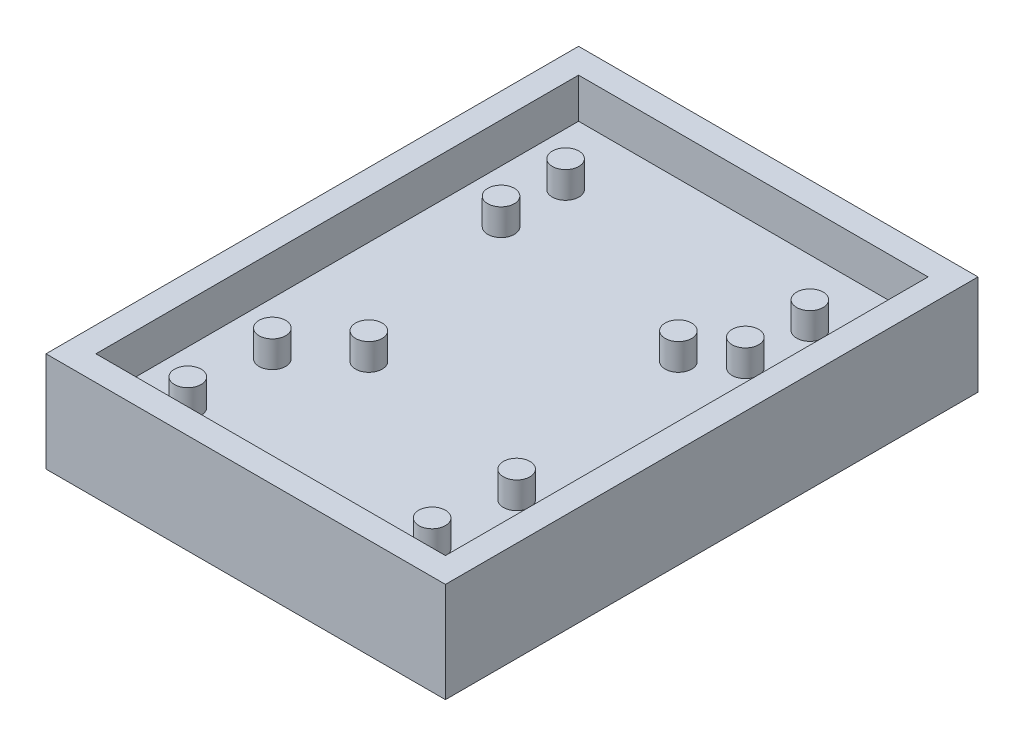
ISO-10303-21;
HEADER;
FILE_DESCRIPTION(('STEP AP214'),'2;1');
FILE_NAME('part.step','',(''),(''),'','','');
FILE_SCHEMA(('AUTOMOTIVE_DESIGN { 1 0 10303 214 1 1 1 1 }'));
ENDSEC;
DATA;
#1=APPLICATION_CONTEXT('core data for automotive mechanical design processes');
#2=APPLICATION_PROTOCOL_DEFINITION('international standard','automotive_design',2000,#1);
#3=PRODUCT_CONTEXT('',#1,'mechanical');
#4=PRODUCT('Part','Part','',(#3));
#5=PRODUCT_RELATED_PRODUCT_CATEGORY('part','',(#4));
#6=PRODUCT_DEFINITION_FORMATION('','',#4);
#7=PRODUCT_DEFINITION_CONTEXT('part definition',#1,'design');
#8=PRODUCT_DEFINITION('design','',#6,#7);
#9=PRODUCT_DEFINITION_SHAPE('','',#8);
#10=(LENGTH_UNIT() NAMED_UNIT(*) SI_UNIT(.MILLI.,.METRE.));
#11=(NAMED_UNIT(*) PLANE_ANGLE_UNIT() SI_UNIT($,.RADIAN.));
#12=(NAMED_UNIT(*) SI_UNIT($,.STERADIAN.) SOLID_ANGLE_UNIT());
#13=UNCERTAINTY_MEASURE_WITH_UNIT(LENGTH_MEASURE(1.E-05),#10,'distance_accuracy_value','');
#14=(GEOMETRIC_REPRESENTATION_CONTEXT(3) GLOBAL_UNCERTAINTY_ASSIGNED_CONTEXT((#13)) GLOBAL_UNIT_ASSIGNED_CONTEXT((#10,
#11,#12)) REPRESENTATION_CONTEXT('',''));
#15=CARTESIAN_POINT('',(0.,0.,0.));
#16=DIRECTION('',(0.,0.,1.));
#17=DIRECTION('',(1.,0.,0.));
#18=AXIS2_PLACEMENT_3D('',#15,#16,#17);
#19=CARTESIAN_POINT('',(60.,30.,80.));
#20=DIRECTION('',(0.,0.,1.));
#21=DIRECTION('',(1.,0.,0.));
#22=AXIS2_PLACEMENT_3D('',#19,#20,#21);
#23=PLANE('',#22);
#24=DIRECTION('',(-1.,0.,0.));
#25=VECTOR('',#24,1.);
#26=CARTESIAN_POINT('',(60.,0.,80.));
#27=LINE('',#26,#25);
#28=CARTESIAN_POINT('',(60.,0.,80.));
#29=VERTEX_POINT('',#28);
#30=CARTESIAN_POINT('',(-60.,0.,80.));
#31=VERTEX_POINT('',#30);
#32=EDGE_CURVE('E164',#29,#31,#27,.T.);
#33=ORIENTED_EDGE('',*,*,#32,.F.);
#34=DIRECTION('',(0.,-1.,0.));
#35=VECTOR('',#34,1.);
#36=CARTESIAN_POINT('',(60.,30.,80.));
#37=LINE('',#36,#35);
#38=CARTESIAN_POINT('',(60.,30.,80.));
#39=VERTEX_POINT('',#38);
#40=EDGE_CURVE('E67',#39,#29,#37,.T.);
#41=ORIENTED_EDGE('',*,*,#40,.F.);
#42=DIRECTION('',(-1.,0.,0.));
#43=VECTOR('',#42,1.);
#44=CARTESIAN_POINT('',(60.,30.,80.));
#45=LINE('',#44,#43);
#46=CARTESIAN_POINT('',(-60.,30.,80.));
#47=VERTEX_POINT('',#46);
#48=EDGE_CURVE('E170',#39,#47,#45,.T.);
#49=ORIENTED_EDGE('',*,*,#48,.T.);
#50=DIRECTION('',(0.,-1.,0.));
#51=VECTOR('',#50,1.);
#52=CARTESIAN_POINT('',(-60.,30.,80.));
#53=LINE('',#52,#51);
#54=EDGE_CURVE('E182',#47,#31,#53,.T.);
#55=ORIENTED_EDGE('',*,*,#54,.T.);
#56=EDGE_LOOP('',(#33,#41,#49,#55));
#57=FACE_BOUND('',#56,.T.);
#58=ADVANCED_FACE('F43',(#57),#23,.T.);
#59=CARTESIAN_POINT('',(60.,30.,-80.));
#60=DIRECTION('',(1.,0.,0.));
#61=DIRECTION('',(0.,0.,-1.));
#62=AXIS2_PLACEMENT_3D('',#59,#60,#61);
#63=PLANE('',#62);
#64=DIRECTION('',(0.,0.,1.));
#65=VECTOR('',#64,1.);
#66=CARTESIAN_POINT('',(60.,0.,-80.));
#67=LINE('',#66,#65);
#68=CARTESIAN_POINT('',(60.,0.,-80.));
#69=VERTEX_POINT('',#68);
#70=EDGE_CURVE('E173',#69,#29,#67,.T.);
#71=ORIENTED_EDGE('',*,*,#70,.F.);
#72=DIRECTION('',(0.,-1.,0.));
#73=VECTOR('',#72,1.);
#74=CARTESIAN_POINT('',(60.,30.,-80.));
#75=LINE('',#74,#73);
#76=CARTESIAN_POINT('',(60.,30.,-80.));
#77=VERTEX_POINT('',#76);
#78=EDGE_CURVE('E199',#77,#69,#75,.T.);
#79=ORIENTED_EDGE('',*,*,#78,.F.);
#80=DIRECTION('',(0.,0.,1.));
#81=VECTOR('',#80,1.);
#82=CARTESIAN_POINT('',(60.,30.,-80.));
#83=LINE('',#82,#81);
#84=EDGE_CURVE('E179',#77,#39,#83,.T.);
#85=ORIENTED_EDGE('',*,*,#84,.T.);
#86=ORIENTED_EDGE('',*,*,#40,.T.);
#87=EDGE_LOOP('',(#71,#79,#85,#86));
#88=FACE_BOUND('',#87,.T.);
#89=ADVANCED_FACE('F277',(#88),#63,.T.);
#90=CARTESIAN_POINT('',(60.,30.,-80.));
#91=DIRECTION('',(0.,0.,1.));
#92=DIRECTION('',(1.,0.,0.));
#93=AXIS2_PLACEMENT_3D('',#90,#91,#92);
#94=PLANE('',#93);
#95=DIRECTION('',(-1.,0.,0.));
#96=VECTOR('',#95,1.);
#97=CARTESIAN_POINT('',(60.,0.,-80.));
#98=LINE('',#97,#96);
#99=CARTESIAN_POINT('',(-60.,0.,-80.));
#100=VERTEX_POINT('',#99);
#101=EDGE_CURVE('E190',#69,#100,#98,.T.);
#102=ORIENTED_EDGE('',*,*,#101,.T.);
#103=DIRECTION('',(0.,-1.,0.));
#104=VECTOR('',#103,1.);
#105=CARTESIAN_POINT('',(-60.,30.,-80.));
#106=LINE('',#105,#104);
#107=CARTESIAN_POINT('',(-60.,30.,-80.));
#108=VERTEX_POINT('',#107);
#109=EDGE_CURVE('E202',#108,#100,#106,.T.);
#110=ORIENTED_EDGE('',*,*,#109,.F.);
#111=DIRECTION('',(-1.,0.,0.));
#112=VECTOR('',#111,1.);
#113=CARTESIAN_POINT('',(60.,30.,-80.));
#114=LINE('',#113,#112);
#115=EDGE_CURVE('E176',#77,#108,#114,.T.);
#116=ORIENTED_EDGE('',*,*,#115,.F.);
#117=ORIENTED_EDGE('',*,*,#78,.T.);
#118=EDGE_LOOP('',(#102,#110,#116,#117));
#119=FACE_BOUND('',#118,.T.);
#120=ADVANCED_FACE('F281',(#119),#94,.F.);
#121=CARTESIAN_POINT('',(-60.,30.,-80.));
#122=DIRECTION('',(1.,0.,0.));
#123=DIRECTION('',(0.,0.,-1.));
#124=AXIS2_PLACEMENT_3D('',#121,#122,#123);
#125=PLANE('',#124);
#126=DIRECTION('',(0.,0.,1.));
#127=VECTOR('',#126,1.);
#128=CARTESIAN_POINT('',(-60.,0.,-80.));
#129=LINE('',#128,#127);
#130=EDGE_CURVE('E186',#100,#31,#129,.T.);
#131=ORIENTED_EDGE('',*,*,#130,.T.);
#132=ORIENTED_EDGE('',*,*,#54,.F.);
#133=DIRECTION('',(0.,0.,1.));
#134=VECTOR('',#133,1.);
#135=CARTESIAN_POINT('',(-60.,30.,-80.));
#136=LINE('',#135,#134);
#137=EDGE_CURVE('E93',#108,#47,#136,.T.);
#138=ORIENTED_EDGE('',*,*,#137,.F.);
#139=ORIENTED_EDGE('',*,*,#109,.T.);
#140=EDGE_LOOP('',(#131,#132,#138,#139));
#141=FACE_BOUND('',#140,.T.);
#142=ADVANCED_FACE('F293',(#141),#125,.F.);
#143=CARTESIAN_POINT('',(0.,30.,0.));
#144=DIRECTION('',(0.,1.,0.));
#145=DIRECTION('',(0.,0.,1.));
#146=AXIS2_PLACEMENT_3D('',#143,#144,#145);
#147=PLANE('',#146);
#148=DIRECTION('',(1.,0.,0.));
#149=VECTOR('',#148,1.);
#150=CARTESIAN_POINT('',(-52.5,30.,72.5));
#151=LINE('',#150,#149);
#152=CARTESIAN_POINT('',(-52.5,30.,72.5));
#153=VERTEX_POINT('',#152);
#154=CARTESIAN_POINT('',(52.5,30.,72.5));
#155=VERTEX_POINT('',#154);
#156=EDGE_CURVE('E58',#153,#155,#151,.T.);
#157=ORIENTED_EDGE('',*,*,#156,.F.);
#158=DIRECTION('',(0.,0.,1.));
#159=VECTOR('',#158,1.);
#160=CARTESIAN_POINT('',(-52.5,30.,-72.5));
#161=LINE('',#160,#159);
#162=CARTESIAN_POINT('',(-52.5,30.,-72.5));
#163=VERTEX_POINT('',#162);
#164=EDGE_CURVE('E139',#163,#153,#161,.T.);
#165=ORIENTED_EDGE('',*,*,#164,.F.);
#166=DIRECTION('',(1.,0.,0.));
#167=VECTOR('',#166,1.);
#168=CARTESIAN_POINT('',(-52.5,30.,-72.5));
#169=LINE('',#168,#167);
#170=CARTESIAN_POINT('',(52.5,30.,-72.5));
#171=VERTEX_POINT('',#170);
#172=EDGE_CURVE('E143',#163,#171,#169,.T.);
#173=ORIENTED_EDGE('',*,*,#172,.T.);
#174=DIRECTION('',(0.,0.,1.));
#175=VECTOR('',#174,1.);
#176=CARTESIAN_POINT('',(52.5,30.,-72.5));
#177=LINE('',#176,#175);
#178=EDGE_CURVE('E155',#171,#155,#177,.T.);
#179=ORIENTED_EDGE('',*,*,#178,.T.);
#180=EDGE_LOOP('',(#157,#165,#173,#179));
#181=FACE_BOUND('',#180,.T.);
#182=ORIENTED_EDGE('',*,*,#48,.F.);
#183=ORIENTED_EDGE('',*,*,#84,.F.);
#184=ORIENTED_EDGE('',*,*,#115,.T.);
#185=ORIENTED_EDGE('',*,*,#137,.T.);
#186=EDGE_LOOP('',(#182,#183,#184,#185));
#187=FACE_BOUND('',#186,.T.);
#188=ADVANCED_FACE('F291',(#181,#187),#147,.T.);
#189=CARTESIAN_POINT('',(0.,0.,0.));
#190=DIRECTION('',(0.,1.,0.));
#191=DIRECTION('',(0.,0.,1.));
#192=AXIS2_PLACEMENT_3D('',#189,#190,#191);
#193=PLANE('',#192);
#194=ORIENTED_EDGE('',*,*,#32,.T.);
#195=ORIENTED_EDGE('',*,*,#130,.F.);
#196=ORIENTED_EDGE('',*,*,#101,.F.);
#197=ORIENTED_EDGE('',*,*,#70,.T.);
#198=EDGE_LOOP('',(#194,#195,#196,#197));
#199=FACE_BOUND('',#198,.T.);
#200=ADVANCED_FACE('F286',(#199),#193,.F.);
#201=CARTESIAN_POINT('',(-52.5,18.,72.5));
#202=DIRECTION('',(0.,0.,1.));
#203=DIRECTION('',(1.,0.,0.));
#204=AXIS2_PLACEMENT_3D('',#201,#202,#203);
#205=PLANE('',#204);
#206=ORIENTED_EDGE('',*,*,#156,.T.);
#207=DIRECTION('',(0.,1.,0.));
#208=VECTOR('',#207,1.);
#209=CARTESIAN_POINT('',(52.5,18.,72.5));
#210=LINE('',#209,#208);
#211=CARTESIAN_POINT('',(52.5,18.,72.5));
#212=VERTEX_POINT('',#211);
#213=EDGE_CURVE('E120',#212,#155,#210,.T.);
#214=ORIENTED_EDGE('',*,*,#213,.F.);
#215=DIRECTION('',(1.,0.,0.));
#216=VECTOR('',#215,1.);
#217=CARTESIAN_POINT('',(-52.5,18.,72.5));
#218=LINE('',#217,#216);
#219=CARTESIAN_POINT('',(-52.5,18.,72.5));
#220=VERTEX_POINT('',#219);
#221=EDGE_CURVE('E128',#220,#212,#218,.T.);
#222=ORIENTED_EDGE('',*,*,#221,.F.);
#223=DIRECTION('',(0.,1.,0.));
#224=VECTOR('',#223,1.);
#225=CARTESIAN_POINT('',(-52.5,18.,72.5));
#226=LINE('',#225,#224);
#227=EDGE_CURVE('E161',#220,#153,#226,.T.);
#228=ORIENTED_EDGE('',*,*,#227,.T.);
#229=EDGE_LOOP('',(#206,#214,#222,#228));
#230=FACE_BOUND('',#229,.T.);
#231=ADVANCED_FACE('F131',(#230),#205,.F.);
#232=CARTESIAN_POINT('',(-52.5,18.,-72.5));
#233=DIRECTION('',(-1.,0.,0.));
#234=DIRECTION('',(0.,0.,1.));
#235=AXIS2_PLACEMENT_3D('',#232,#233,#234);
#236=PLANE('',#235);
#237=ORIENTED_EDGE('',*,*,#164,.T.);
#238=ORIENTED_EDGE('',*,*,#227,.F.);
#239=DIRECTION('',(0.,0.,1.));
#240=VECTOR('',#239,1.);
#241=CARTESIAN_POINT('',(-52.5,18.,-72.5));
#242=LINE('',#241,#240);
#243=CARTESIAN_POINT('',(-52.5,18.,-72.5));
#244=VERTEX_POINT('',#243);
#245=EDGE_CURVE('E134',#244,#220,#242,.T.);
#246=ORIENTED_EDGE('',*,*,#245,.F.);
#247=DIRECTION('',(0.,1.,0.));
#248=VECTOR('',#247,1.);
#249=CARTESIAN_POINT('',(-52.5,18.,-72.5));
#250=LINE('',#249,#248);
#251=EDGE_CURVE('E165',#244,#163,#250,.T.);
#252=ORIENTED_EDGE('',*,*,#251,.T.);
#253=EDGE_LOOP('',(#237,#238,#246,#252));
#254=FACE_BOUND('',#253,.T.);
#255=ADVANCED_FACE('F336',(#254),#236,.F.);
#256=CARTESIAN_POINT('',(-52.5,18.,-72.5));
#257=DIRECTION('',(0.,0.,1.));
#258=DIRECTION('',(1.,0.,0.));
#259=AXIS2_PLACEMENT_3D('',#256,#257,#258);
#260=PLANE('',#259);
#261=ORIENTED_EDGE('',*,*,#172,.F.);
#262=ORIENTED_EDGE('',*,*,#251,.F.);
#263=DIRECTION('',(1.,0.,0.));
#264=VECTOR('',#263,1.);
#265=CARTESIAN_POINT('',(-52.5,18.,-72.5));
#266=LINE('',#265,#264);
#267=CARTESIAN_POINT('',(52.5,18.,-72.5));
#268=VERTEX_POINT('',#267);
#269=EDGE_CURVE('E127',#244,#268,#266,.T.);
#270=ORIENTED_EDGE('',*,*,#269,.T.);
#271=DIRECTION('',(0.,1.,0.));
#272=VECTOR('',#271,1.);
#273=CARTESIAN_POINT('',(52.5,18.,-72.5));
#274=LINE('',#273,#272);
#275=EDGE_CURVE('E122',#268,#171,#274,.T.);
#276=ORIENTED_EDGE('',*,*,#275,.T.);
#277=EDGE_LOOP('',(#261,#262,#270,#276));
#278=FACE_BOUND('',#277,.T.);
#279=ADVANCED_FACE('F345',(#278),#260,.T.);
#280=CARTESIAN_POINT('',(52.5,18.,-72.5));
#281=DIRECTION('',(-1.,0.,0.));
#282=DIRECTION('',(0.,0.,1.));
#283=AXIS2_PLACEMENT_3D('',#280,#281,#282);
#284=PLANE('',#283);
#285=ORIENTED_EDGE('',*,*,#178,.F.);
#286=ORIENTED_EDGE('',*,*,#275,.F.);
#287=DIRECTION('',(0.,0.,1.));
#288=VECTOR('',#287,1.);
#289=CARTESIAN_POINT('',(52.5,18.,-72.5));
#290=LINE('',#289,#288);
#291=EDGE_CURVE('E117',#268,#212,#290,.T.);
#292=ORIENTED_EDGE('',*,*,#291,.T.);
#293=ORIENTED_EDGE('',*,*,#213,.T.);
#294=EDGE_LOOP('',(#285,#286,#292,#293));
#295=FACE_BOUND('',#294,.T.);
#296=ADVANCED_FACE('F119',(#295),#284,.T.);
#297=CARTESIAN_POINT('',(0.,18.,0.));
#298=DIRECTION('',(0.,-1.,0.));
#299=DIRECTION('',(0.,0.,-1.));
#300=AXIS2_PLACEMENT_3D('',#297,#298,#299);
#301=PLANE('',#300);
#302=CARTESIAN_POINT('',(36.7,18.,-52.8096236155543));
#303=DIRECTION('',(0.,-1.,0.));
#304=DIRECTION('',(0.,0.,-1.));
#305=AXIS2_PLACEMENT_3D('',#302,#303,#304);
#306=CIRCLE('',#305,4.00000000000001);
#307=CARTESIAN_POINT('',(36.7,18.,-56.8096236155543));
#308=VERTEX_POINT('',#307);
#309=EDGE_CURVE('E11',#308,#308,#306,.F.);
#310=ORIENTED_EDGE('',*,*,#309,.F.);
#311=EDGE_LOOP('',(#310));
#312=FACE_BOUND('',#311,.T.);
#313=CARTESIAN_POINT('',(-36.7,18.,-52.8096236155543));
#314=DIRECTION('',(0.,-1.,0.));
#315=DIRECTION('',(0.,0.,-1.));
#316=AXIS2_PLACEMENT_3D('',#313,#314,#315);
#317=CIRCLE('',#316,4.00000000000001);
#318=CARTESIAN_POINT('',(-36.7,18.,-56.8096236155543));
#319=VERTEX_POINT('',#318);
#320=EDGE_CURVE('E51',#319,#319,#317,.F.);
#321=ORIENTED_EDGE('',*,*,#320,.F.);
#322=EDGE_LOOP('',(#321));
#323=FACE_BOUND('',#322,.T.);
#324=CARTESIAN_POINT('',(-36.7,18.,-33.4096236155543));
#325=DIRECTION('',(0.,-1.,0.));
#326=DIRECTION('',(0.,0.,-1.));
#327=AXIS2_PLACEMENT_3D('',#324,#325,#326);
#328=CIRCLE('',#327,4.00000000000001);
#329=CARTESIAN_POINT('',(-36.7,18.,-37.4096236155543));
#330=VERTEX_POINT('',#329);
#331=EDGE_CURVE('E235',#330,#330,#328,.F.);
#332=ORIENTED_EDGE('',*,*,#331,.F.);
#333=EDGE_LOOP('',(#332));
#334=FACE_BOUND('',#333,.T.);
#335=CARTESIAN_POINT('',(36.7,18.,-33.4096236155543));
#336=DIRECTION('',(0.,-1.,0.));
#337=DIRECTION('',(0.,0.,-1.));
#338=AXIS2_PLACEMENT_3D('',#335,#336,#337);
#339=CIRCLE('',#338,4.);
#340=CARTESIAN_POINT('',(36.7,18.,-37.4096236155543));
#341=VERTEX_POINT('',#340);
#342=EDGE_CURVE('E231',#341,#341,#339,.F.);
#343=ORIENTED_EDGE('',*,*,#342,.F.);
#344=EDGE_LOOP('',(#343));
#345=FACE_BOUND('',#344,.T.);
#346=CARTESIAN_POINT('',(-36.7,18.,60.7));
#347=DIRECTION('',(0.,-1.,0.));
#348=DIRECTION('',(0.,0.,-1.));
#349=AXIS2_PLACEMENT_3D('',#346,#347,#348);
#350=CIRCLE('',#349,4.);
#351=CARTESIAN_POINT('',(-36.7,18.,56.7));
#352=VERTEX_POINT('',#351);
#353=EDGE_CURVE('E227',#352,#352,#350,.F.);
#354=ORIENTED_EDGE('',*,*,#353,.F.);
#355=EDGE_LOOP('',(#354));
#356=FACE_BOUND('',#355,.T.);
#357=CARTESIAN_POINT('',(36.7,18.,60.7));
#358=DIRECTION('',(0.,-1.,0.));
#359=DIRECTION('',(0.,0.,-1.));
#360=AXIS2_PLACEMENT_3D('',#357,#358,#359);
#361=CIRCLE('',#360,4.00000000000001);
#362=CARTESIAN_POINT('',(36.7,18.,56.7));
#363=VERTEX_POINT('',#362);
#364=EDGE_CURVE('E223',#363,#363,#361,.F.);
#365=ORIENTED_EDGE('',*,*,#364,.F.);
#366=EDGE_LOOP('',(#365));
#367=FACE_BOUND('',#366,.T.);
#368=CARTESIAN_POINT('',(36.7,18.,35.3));
#369=DIRECTION('',(0.,-1.,0.));
#370=DIRECTION('',(0.,0.,-1.));
#371=AXIS2_PLACEMENT_3D('',#368,#369,#370);
#372=CIRCLE('',#371,4.00000000000001);
#373=CARTESIAN_POINT('',(36.7,18.,31.3));
#374=VERTEX_POINT('',#373);
#375=EDGE_CURVE('E219',#374,#374,#372,.F.);
#376=ORIENTED_EDGE('',*,*,#375,.F.);
#377=EDGE_LOOP('',(#376));
#378=FACE_BOUND('',#377,.T.);
#379=CARTESIAN_POINT('',(-36.7,18.,35.3));
#380=DIRECTION('',(0.,-1.,0.));
#381=DIRECTION('',(0.,0.,-1.));
#382=AXIS2_PLACEMENT_3D('',#379,#380,#381);
#383=CIRCLE('',#382,4.00000000000001);
#384=CARTESIAN_POINT('',(-36.7,18.,31.3));
#385=VERTEX_POINT('',#384);
#386=EDGE_CURVE('E215',#385,#385,#383,.F.);
#387=ORIENTED_EDGE('',*,*,#386,.F.);
#388=EDGE_LOOP('',(#387));
#389=FACE_BOUND('',#388,.T.);
#390=CARTESIAN_POINT('',(25.,18.,-25.));
#391=DIRECTION('',(0.,-1.,0.));
#392=DIRECTION('',(0.,0.,-1.));
#393=AXIS2_PLACEMENT_3D('',#390,#391,#392);
#394=CIRCLE('',#393,4.);
#395=CARTESIAN_POINT('',(25.,18.,-29.));
#396=VERTEX_POINT('',#395);
#397=EDGE_CURVE('E211',#396,#396,#394,.F.);
#398=ORIENTED_EDGE('',*,*,#397,.F.);
#399=EDGE_LOOP('',(#398));
#400=FACE_BOUND('',#399,.T.);
#401=CARTESIAN_POINT('',(-21.5,18.,21.5));
#402=DIRECTION('',(0.,-1.,0.));
#403=DIRECTION('',(0.,0.,-1.));
#404=AXIS2_PLACEMENT_3D('',#401,#402,#403);
#405=CIRCLE('',#404,4.);
#406=CARTESIAN_POINT('',(-21.5,18.,17.5));
#407=VERTEX_POINT('',#406);
#408=EDGE_CURVE('E198',#407,#407,#405,.F.);
#409=ORIENTED_EDGE('',*,*,#408,.F.);
#410=EDGE_LOOP('',(#409));
#411=FACE_BOUND('',#410,.T.);
#412=ORIENTED_EDGE('',*,*,#221,.T.);
#413=ORIENTED_EDGE('',*,*,#291,.F.);
#414=ORIENTED_EDGE('',*,*,#269,.F.);
#415=ORIENTED_EDGE('',*,*,#245,.T.);
#416=EDGE_LOOP('',(#412,#413,#414,#415));
#417=FACE_BOUND('',#416,.T.);
#418=ADVANCED_FACE('F136',(#312,#323,#334,#345,#356,#367,#378,#389,#400,#411,#417),#301,.F.);
#419=CARTESIAN_POINT('',(-21.5,26.,21.5));
#420=DIRECTION('',(0.,-1.,0.));
#421=DIRECTION('',(0.,0.,-1.));
#422=AXIS2_PLACEMENT_3D('',#419,#420,#421);
#423=CYLINDRICAL_SURFACE('',#422,4.);
#424=CARTESIAN_POINT('',(-21.5,26.,21.5));
#425=DIRECTION('',(0.,1.,0.));
#426=DIRECTION('',(0.,0.,1.));
#427=AXIS2_PLACEMENT_3D('',#424,#425,#426);
#428=CIRCLE('',#427,4.);
#429=CARTESIAN_POINT('',(-21.5,26.,25.5));
#430=VERTEX_POINT('',#429);
#431=EDGE_CURVE('E146',#430,#430,#428,.T.);
#432=ORIENTED_EDGE('',*,*,#431,.F.);
#433=EDGE_LOOP('',(#432));
#434=FACE_BOUND('',#433,.T.);
#435=ORIENTED_EDGE('',*,*,#408,.T.);
#436=EDGE_LOOP('',(#435));
#437=FACE_BOUND('',#436,.T.);
#438=ADVANCED_FACE('F246',(#434,#437),#423,.T.);
#439=CARTESIAN_POINT('',(-21.5,26.,21.5));
#440=DIRECTION('',(0.,1.,0.));
#441=DIRECTION('',(0.,0.,1.));
#442=AXIS2_PLACEMENT_3D('',#439,#440,#441);
#443=PLANE('',#442);
#444=ORIENTED_EDGE('',*,*,#431,.T.);
#445=EDGE_LOOP('',(#444));
#446=FACE_BOUND('',#445,.T.);
#447=ADVANCED_FACE('F266',(#446),#443,.T.);
#448=CARTESIAN_POINT('',(25.,26.,-25.));
#449=DIRECTION('',(0.,-1.,0.));
#450=DIRECTION('',(0.,0.,-1.));
#451=AXIS2_PLACEMENT_3D('',#448,#449,#450);
#452=CYLINDRICAL_SURFACE('',#451,4.);
#453=CARTESIAN_POINT('',(25.,26.,-25.));
#454=DIRECTION('',(0.,1.,0.));
#455=DIRECTION('',(0.,0.,1.));
#456=AXIS2_PLACEMENT_3D('',#453,#454,#455);
#457=CIRCLE('',#456,4.);
#458=CARTESIAN_POINT('',(25.,26.,-21.));
#459=VERTEX_POINT('',#458);
#460=EDGE_CURVE('E661',#459,#459,#457,.T.);
#461=ORIENTED_EDGE('',*,*,#460,.F.);
#462=EDGE_LOOP('',(#461));
#463=FACE_BOUND('',#462,.T.);
#464=ORIENTED_EDGE('',*,*,#397,.T.);
#465=EDGE_LOOP('',(#464));
#466=FACE_BOUND('',#465,.T.);
#467=ADVANCED_FACE('F272',(#463,#466),#452,.T.);
#468=CARTESIAN_POINT('',(25.,26.,-25.));
#469=DIRECTION('',(0.,1.,0.));
#470=DIRECTION('',(0.,0.,1.));
#471=AXIS2_PLACEMENT_3D('',#468,#469,#470);
#472=PLANE('',#471);
#473=ORIENTED_EDGE('',*,*,#460,.T.);
#474=EDGE_LOOP('',(#473));
#475=FACE_BOUND('',#474,.T.);
#476=ADVANCED_FACE('F393',(#475),#472,.T.);
#477=CARTESIAN_POINT('',(-36.7,26.,35.3));
#478=DIRECTION('',(0.,-1.,0.));
#479=DIRECTION('',(0.,0.,-1.));
#480=AXIS2_PLACEMENT_3D('',#477,#478,#479);
#481=CYLINDRICAL_SURFACE('',#480,4.00000000000001);
#482=CARTESIAN_POINT('',(-36.7,26.,35.3));
#483=DIRECTION('',(0.,1.,0.));
#484=DIRECTION('',(0.,0.,1.));
#485=AXIS2_PLACEMENT_3D('',#482,#483,#484);
#486=CIRCLE('',#485,4.00000000000001);
#487=CARTESIAN_POINT('',(-36.7,26.,39.3));
#488=VERTEX_POINT('',#487);
#489=EDGE_CURVE('E658',#488,#488,#486,.T.);
#490=ORIENTED_EDGE('',*,*,#489,.F.);
#491=EDGE_LOOP('',(#490));
#492=FACE_BOUND('',#491,.T.);
#493=ORIENTED_EDGE('',*,*,#386,.T.);
#494=EDGE_LOOP('',(#493));
#495=FACE_BOUND('',#494,.T.);
#496=ADVANCED_FACE('F404',(#492,#495),#481,.T.);
#497=CARTESIAN_POINT('',(-36.7,26.,35.3));
#498=DIRECTION('',(0.,1.,0.));
#499=DIRECTION('',(0.,0.,1.));
#500=AXIS2_PLACEMENT_3D('',#497,#498,#499);
#501=PLANE('',#500);
#502=ORIENTED_EDGE('',*,*,#489,.T.);
#503=EDGE_LOOP('',(#502));
#504=FACE_BOUND('',#503,.T.);
#505=ADVANCED_FACE('F415',(#504),#501,.T.);
#506=CARTESIAN_POINT('',(36.7,26.,35.3));
#507=DIRECTION('',(0.,-1.,0.));
#508=DIRECTION('',(0.,0.,-1.));
#509=AXIS2_PLACEMENT_3D('',#506,#507,#508);
#510=CYLINDRICAL_SURFACE('',#509,4.00000000000001);
#511=CARTESIAN_POINT('',(36.7,26.,35.3));
#512=DIRECTION('',(0.,1.,0.));
#513=DIRECTION('',(0.,0.,1.));
#514=AXIS2_PLACEMENT_3D('',#511,#512,#513);
#515=CIRCLE('',#514,4.00000000000001);
#516=CARTESIAN_POINT('',(36.7,26.,39.3));
#517=VERTEX_POINT('',#516);
#518=EDGE_CURVE('E654',#517,#517,#515,.T.);
#519=ORIENTED_EDGE('',*,*,#518,.F.);
#520=EDGE_LOOP('',(#519));
#521=FACE_BOUND('',#520,.T.);
#522=ORIENTED_EDGE('',*,*,#375,.T.);
#523=EDGE_LOOP('',(#522));
#524=FACE_BOUND('',#523,.T.);
#525=ADVANCED_FACE('F426',(#521,#524),#510,.T.);
#526=CARTESIAN_POINT('',(36.7,26.,35.3));
#527=DIRECTION('',(0.,1.,0.));
#528=DIRECTION('',(0.,0.,1.));
#529=AXIS2_PLACEMENT_3D('',#526,#527,#528);
#530=PLANE('',#529);
#531=ORIENTED_EDGE('',*,*,#518,.T.);
#532=EDGE_LOOP('',(#531));
#533=FACE_BOUND('',#532,.T.);
#534=ADVANCED_FACE('F437',(#533),#530,.T.);
#535=CARTESIAN_POINT('',(36.7,26.,60.7));
#536=DIRECTION('',(0.,-1.,0.));
#537=DIRECTION('',(0.,0.,-1.));
#538=AXIS2_PLACEMENT_3D('',#535,#536,#537);
#539=CYLINDRICAL_SURFACE('',#538,4.00000000000001);
#540=CARTESIAN_POINT('',(36.7,26.,60.7));
#541=DIRECTION('',(0.,1.,0.));
#542=DIRECTION('',(0.,0.,1.));
#543=AXIS2_PLACEMENT_3D('',#540,#541,#542);
#544=CIRCLE('',#543,4.00000000000001);
#545=CARTESIAN_POINT('',(36.7,26.,64.7));
#546=VERTEX_POINT('',#545);
#547=EDGE_CURVE('E650',#546,#546,#544,.T.);
#548=ORIENTED_EDGE('',*,*,#547,.F.);
#549=EDGE_LOOP('',(#548));
#550=FACE_BOUND('',#549,.T.);
#551=ORIENTED_EDGE('',*,*,#364,.T.);
#552=EDGE_LOOP('',(#551));
#553=FACE_BOUND('',#552,.T.);
#554=ADVANCED_FACE('F448',(#550,#553),#539,.T.);
#555=CARTESIAN_POINT('',(36.7,26.,60.7));
#556=DIRECTION('',(0.,1.,0.));
#557=DIRECTION('',(0.,0.,1.));
#558=AXIS2_PLACEMENT_3D('',#555,#556,#557);
#559=PLANE('',#558);
#560=ORIENTED_EDGE('',*,*,#547,.T.);
#561=EDGE_LOOP('',(#560));
#562=FACE_BOUND('',#561,.T.);
#563=ADVANCED_FACE('F459',(#562),#559,.T.);
#564=CARTESIAN_POINT('',(-36.7,26.,60.7));
#565=DIRECTION('',(0.,-1.,0.));
#566=DIRECTION('',(0.,0.,-1.));
#567=AXIS2_PLACEMENT_3D('',#564,#565,#566);
#568=CYLINDRICAL_SURFACE('',#567,4.);
#569=CARTESIAN_POINT('',(-36.7,26.,60.7));
#570=DIRECTION('',(0.,1.,0.));
#571=DIRECTION('',(0.,0.,1.));
#572=AXIS2_PLACEMENT_3D('',#569,#570,#571);
#573=CIRCLE('',#572,4.);
#574=CARTESIAN_POINT('',(-36.7,26.,64.7));
#575=VERTEX_POINT('',#574);
#576=EDGE_CURVE('E646',#575,#575,#573,.T.);
#577=ORIENTED_EDGE('',*,*,#576,.F.);
#578=EDGE_LOOP('',(#577));
#579=FACE_BOUND('',#578,.T.);
#580=ORIENTED_EDGE('',*,*,#353,.T.);
#581=EDGE_LOOP('',(#580));
#582=FACE_BOUND('',#581,.T.);
#583=ADVANCED_FACE('F470',(#579,#582),#568,.T.);
#584=CARTESIAN_POINT('',(-36.7,26.,60.7));
#585=DIRECTION('',(0.,1.,0.));
#586=DIRECTION('',(0.,0.,1.));
#587=AXIS2_PLACEMENT_3D('',#584,#585,#586);
#588=PLANE('',#587);
#589=ORIENTED_EDGE('',*,*,#576,.T.);
#590=EDGE_LOOP('',(#589));
#591=FACE_BOUND('',#590,.T.);
#592=ADVANCED_FACE('F481',(#591),#588,.T.);
#593=CARTESIAN_POINT('',(36.7,26.,-33.4096236155543));
#594=DIRECTION('',(0.,-1.,0.));
#595=DIRECTION('',(0.,0.,-1.));
#596=AXIS2_PLACEMENT_3D('',#593,#594,#595);
#597=CYLINDRICAL_SURFACE('',#596,4.);
#598=CARTESIAN_POINT('',(36.7,26.,-33.4096236155543));
#599=DIRECTION('',(0.,1.,0.));
#600=DIRECTION('',(0.,0.,1.));
#601=AXIS2_PLACEMENT_3D('',#598,#599,#600);
#602=CIRCLE('',#601,4.);
#603=CARTESIAN_POINT('',(36.7,26.,-29.4096236155543));
#604=VERTEX_POINT('',#603);
#605=EDGE_CURVE('E642',#604,#604,#602,.T.);
#606=ORIENTED_EDGE('',*,*,#605,.F.);
#607=EDGE_LOOP('',(#606));
#608=FACE_BOUND('',#607,.T.);
#609=ORIENTED_EDGE('',*,*,#342,.T.);
#610=EDGE_LOOP('',(#609));
#611=FACE_BOUND('',#610,.T.);
#612=ADVANCED_FACE('F492',(#608,#611),#597,.T.);
#613=CARTESIAN_POINT('',(36.7,26.,-33.4096236155543));
#614=DIRECTION('',(0.,1.,0.));
#615=DIRECTION('',(0.,0.,1.));
#616=AXIS2_PLACEMENT_3D('',#613,#614,#615);
#617=PLANE('',#616);
#618=ORIENTED_EDGE('',*,*,#605,.T.);
#619=EDGE_LOOP('',(#618));
#620=FACE_BOUND('',#619,.T.);
#621=ADVANCED_FACE('F503',(#620),#617,.T.);
#622=CARTESIAN_POINT('',(-36.7,26.,-33.4096236155543));
#623=DIRECTION('',(0.,-1.,0.));
#624=DIRECTION('',(0.,0.,-1.));
#625=AXIS2_PLACEMENT_3D('',#622,#623,#624);
#626=CYLINDRICAL_SURFACE('',#625,4.00000000000001);
#627=CARTESIAN_POINT('',(-36.7,26.,-33.4096236155543));
#628=DIRECTION('',(0.,1.,0.));
#629=DIRECTION('',(0.,0.,1.));
#630=AXIS2_PLACEMENT_3D('',#627,#628,#629);
#631=CIRCLE('',#630,4.00000000000001);
#632=CARTESIAN_POINT('',(-36.7,26.,-29.4096236155542));
#633=VERTEX_POINT('',#632);
#634=EDGE_CURVE('E636',#633,#633,#631,.T.);
#635=ORIENTED_EDGE('',*,*,#634,.F.);
#636=EDGE_LOOP('',(#635));
#637=FACE_BOUND('',#636,.T.);
#638=ORIENTED_EDGE('',*,*,#331,.T.);
#639=EDGE_LOOP('',(#638));
#640=FACE_BOUND('',#639,.T.);
#641=ADVANCED_FACE('F514',(#637,#640),#626,.T.);
#642=CARTESIAN_POINT('',(-36.7,26.,-33.4096236155543));
#643=DIRECTION('',(0.,1.,0.));
#644=DIRECTION('',(0.,0.,1.));
#645=AXIS2_PLACEMENT_3D('',#642,#643,#644);
#646=PLANE('',#645);
#647=ORIENTED_EDGE('',*,*,#634,.T.);
#648=EDGE_LOOP('',(#647));
#649=FACE_BOUND('',#648,.T.);
#650=ADVANCED_FACE('F525',(#649),#646,.T.);
#651=CARTESIAN_POINT('',(-36.7,26.,-52.8096236155543));
#652=DIRECTION('',(0.,-1.,0.));
#653=DIRECTION('',(0.,0.,-1.));
#654=AXIS2_PLACEMENT_3D('',#651,#652,#653);
#655=CYLINDRICAL_SURFACE('',#654,4.00000000000001);
#656=CARTESIAN_POINT('',(-36.7,26.,-52.8096236155543));
#657=DIRECTION('',(0.,1.,0.));
#658=DIRECTION('',(0.,0.,1.));
#659=AXIS2_PLACEMENT_3D('',#656,#657,#658);
#660=CIRCLE('',#659,4.00000000000001);
#661=CARTESIAN_POINT('',(-36.7,26.,-48.8096236155543));
#662=VERTEX_POINT('',#661);
#663=EDGE_CURVE('E632',#662,#662,#660,.T.);
#664=ORIENTED_EDGE('',*,*,#663,.F.);
#665=EDGE_LOOP('',(#664));
#666=FACE_BOUND('',#665,.T.);
#667=ORIENTED_EDGE('',*,*,#320,.T.);
#668=EDGE_LOOP('',(#667));
#669=FACE_BOUND('',#668,.T.);
#670=ADVANCED_FACE('F242',(#666,#669),#655,.T.);
#671=CARTESIAN_POINT('',(-36.7,26.,-52.8096236155543));
#672=DIRECTION('',(0.,1.,0.));
#673=DIRECTION('',(0.,0.,1.));
#674=AXIS2_PLACEMENT_3D('',#671,#672,#673);
#675=PLANE('',#674);
#676=ORIENTED_EDGE('',*,*,#663,.T.);
#677=EDGE_LOOP('',(#676));
#678=FACE_BOUND('',#677,.T.);
#679=ADVANCED_FACE('F546',(#678),#675,.T.);
#680=CARTESIAN_POINT('',(36.7,26.,-52.8096236155543));
#681=DIRECTION('',(0.,-1.,0.));
#682=DIRECTION('',(0.,0.,-1.));
#683=AXIS2_PLACEMENT_3D('',#680,#681,#682);
#684=CYLINDRICAL_SURFACE('',#683,4.00000000000001);
#685=CARTESIAN_POINT('',(36.7,26.,-52.8096236155543));
#686=DIRECTION('',(0.,1.,0.));
#687=DIRECTION('',(0.,0.,1.));
#688=AXIS2_PLACEMENT_3D('',#685,#686,#687);
#689=CIRCLE('',#688,4.00000000000001);
#690=CARTESIAN_POINT('',(36.7,26.,-48.8096236155543));
#691=VERTEX_POINT('',#690);
#692=EDGE_CURVE('E630',#691,#691,#689,.T.);
#693=ORIENTED_EDGE('',*,*,#692,.F.);
#694=EDGE_LOOP('',(#693));
#695=FACE_BOUND('',#694,.T.);
#696=ORIENTED_EDGE('',*,*,#309,.T.);
#697=EDGE_LOOP('',(#696));
#698=FACE_BOUND('',#697,.T.);
#699=ADVANCED_FACE('F557',(#695,#698),#684,.T.);
#700=CARTESIAN_POINT('',(36.7,26.,-52.8096236155543));
#701=DIRECTION('',(0.,1.,0.));
#702=DIRECTION('',(0.,0.,1.));
#703=AXIS2_PLACEMENT_3D('',#700,#701,#702);
#704=PLANE('',#703);
#705=ORIENTED_EDGE('',*,*,#692,.T.);
#706=EDGE_LOOP('',(#705));
#707=FACE_BOUND('',#706,.T.);
#708=ADVANCED_FACE('F568',(#707),#704,.T.);
#709=CLOSED_SHELL('',(#58,#89,#120,#142,#188,#200,#231,#255,#279,#296,#418,#438,#447,#467,#476,
#496,#505,#525,#534,#554,#563,#583,#592,#612,#621,#641,#650,#670,#679,#699,#708));
#710=MANIFOLD_SOLID_BREP('B2',#709);
#711=ADVANCED_BREP_SHAPE_REPRESENTATION('',(#18,#710),#14);
#712=SHAPE_DEFINITION_REPRESENTATION(#9,#711);
ENDSEC;
END-ISO-10303-21;
